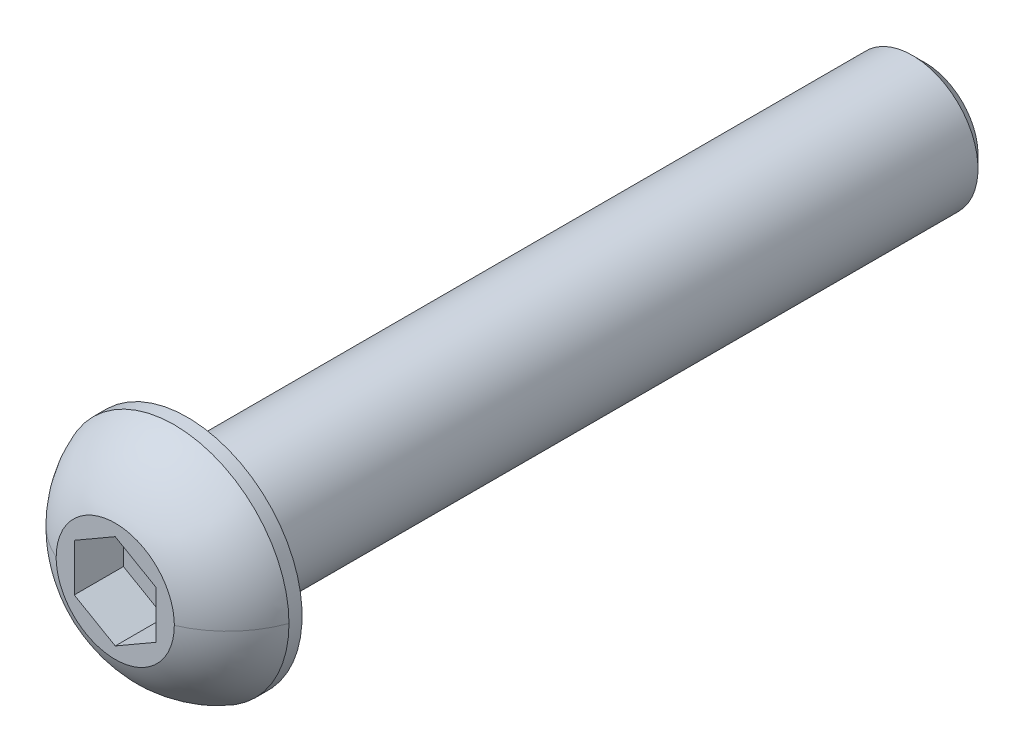
ISO-10303-21;
HEADER;
FILE_DESCRIPTION(('STEP AP214'),'2;1');
FILE_NAME('part.step','',(''),(''),'','','');
FILE_SCHEMA(('AUTOMOTIVE_DESIGN { 1 0 10303 214 1 1 1 1 }'));
ENDSEC;
DATA;
#1=APPLICATION_CONTEXT('core data for automotive mechanical design processes');
#2=APPLICATION_PROTOCOL_DEFINITION('international standard','automotive_design',2000,#1);
#3=PRODUCT_CONTEXT('',#1,'mechanical');
#4=PRODUCT('Part','Part','',(#3));
#5=PRODUCT_RELATED_PRODUCT_CATEGORY('part','',(#4));
#6=PRODUCT_DEFINITION_FORMATION('','',#4);
#7=PRODUCT_DEFINITION_CONTEXT('part definition',#1,'design');
#8=PRODUCT_DEFINITION('design','',#6,#7);
#9=PRODUCT_DEFINITION_SHAPE('','',#8);
#10=(LENGTH_UNIT() NAMED_UNIT(*) SI_UNIT(.MILLI.,.METRE.));
#11=(NAMED_UNIT(*) PLANE_ANGLE_UNIT() SI_UNIT($,.RADIAN.));
#12=(NAMED_UNIT(*) SI_UNIT($,.STERADIAN.) SOLID_ANGLE_UNIT());
#13=UNCERTAINTY_MEASURE_WITH_UNIT(LENGTH_MEASURE(1.E-05),#10,'distance_accuracy_value','');
#14=(GEOMETRIC_REPRESENTATION_CONTEXT(3) GLOBAL_UNCERTAINTY_ASSIGNED_CONTEXT((#13)) GLOBAL_UNIT_ASSIGNED_CONTEXT((#10,
#11,#12)) REPRESENTATION_CONTEXT('',''));
#15=CARTESIAN_POINT('',(0.,0.,0.));
#16=DIRECTION('',(0.,0.,1.));
#17=DIRECTION('',(1.,0.,0.));
#18=AXIS2_PLACEMENT_3D('',#15,#16,#17);
#19=CARTESIAN_POINT('',(0.,0.,1.4));
#20=DIRECTION('',(0.,0.,-1.));
#21=DIRECTION('',(0.,-1.,0.));
#22=AXIS2_PLACEMENT_3D('',#19,#20,#21);
#23=PLANE('',#22);
#24=DIRECTION('',(-0.866025403795548,0.499999999980758,0.));
#25=VECTOR('',#24,1.);
#26=CARTESIAN_POINT('',(1.25,2.16506350945,1.4));
#27=LINE('',#26,#25);
#28=CARTESIAN_POINT('',(2.5,1.443375673,1.4));
#29=VERTEX_POINT('',#28);
#30=CARTESIAN_POINT('',(0.,2.8867513459,1.4));
#31=VERTEX_POINT('',#30);
#32=EDGE_CURVE('E211',#29,#31,#27,.T.);
#33=ORIENTED_EDGE('',*,*,#32,.T.);
#34=DIRECTION('',(-0.866025403795548,-0.499999999980758,0.));
#35=VECTOR('',#34,1.);
#36=CARTESIAN_POINT('',(-1.25,2.16506350945,1.4));
#37=LINE('',#36,#35);
#38=CARTESIAN_POINT('',(-2.5,1.443375673,1.4));
#39=VERTEX_POINT('',#38);
#40=EDGE_CURVE('E194',#31,#39,#37,.T.);
#41=ORIENTED_EDGE('',*,*,#40,.T.);
#42=DIRECTION('',(0.,-1.,0.));
#43=VECTOR('',#42,1.);
#44=CARTESIAN_POINT('',(-2.5,0.,1.4));
#45=LINE('',#44,#43);
#46=CARTESIAN_POINT('',(-2.5,-1.443375673,1.4));
#47=VERTEX_POINT('',#46);
#48=EDGE_CURVE('E235',#39,#47,#45,.T.);
#49=ORIENTED_EDGE('',*,*,#48,.T.);
#50=DIRECTION('',(0.866025403795548,-0.499999999980758,0.));
#51=VECTOR('',#50,1.);
#52=CARTESIAN_POINT('',(-1.25,-2.16506350945,1.4));
#53=LINE('',#52,#51);
#54=CARTESIAN_POINT('',(0.,-2.8867513459,1.4));
#55=VERTEX_POINT('',#54);
#56=EDGE_CURVE('E208',#47,#55,#53,.T.);
#57=ORIENTED_EDGE('',*,*,#56,.T.);
#58=DIRECTION('',(0.866025403795548,0.499999999980758,0.));
#59=VECTOR('',#58,1.);
#60=CARTESIAN_POINT('',(1.25,-2.16506350945,1.4));
#61=LINE('',#60,#59);
#62=CARTESIAN_POINT('',(2.5,-1.443375673,1.4));
#63=VERTEX_POINT('',#62);
#64=EDGE_CURVE('E29',#55,#63,#61,.T.);
#65=ORIENTED_EDGE('',*,*,#64,.T.);
#66=DIRECTION('',(0.,1.,0.));
#67=VECTOR('',#66,1.);
#68=CARTESIAN_POINT('',(2.5,0.7216878365,1.4));
#69=LINE('',#68,#67);
#70=EDGE_CURVE('E11',#63,#29,#69,.T.);
#71=ORIENTED_EDGE('',*,*,#70,.T.);
#72=EDGE_LOOP('',(#33,#41,#49,#57,#65,#71));
#73=FACE_BOUND('',#72,.T.);
#74=ADVANCED_FACE('F16',(#73),#23,.F.);
#75=CARTESIAN_POINT('',(2.5,0.7216878365,4.4));
#76=DIRECTION('',(1.,0.,0.));
#77=DIRECTION('',(0.,1.,0.));
#78=AXIS2_PLACEMENT_3D('',#75,#76,#77);
#79=PLANE('',#78);
#80=DIRECTION('',(0.,0.,1.));
#81=VECTOR('',#80,1.);
#82=CARTESIAN_POINT('',(2.5,-1.443375673,4.4));
#83=LINE('',#82,#81);
#84=CARTESIAN_POINT('',(2.5,-1.443375673,4.39999999992791));
#85=VERTEX_POINT('',#84);
#86=EDGE_CURVE('E96',#63,#85,#83,.T.);
#87=ORIENTED_EDGE('',*,*,#86,.T.);
#88=DIRECTION('',(0.,-1.,0.));
#89=VECTOR('',#88,1.);
#90=CARTESIAN_POINT('',(2.5,0.,4.39999999971163));
#91=LINE('',#90,#89);
#92=CARTESIAN_POINT('',(2.5,1.443375673,4.39999999992791));
#93=VERTEX_POINT('',#92);
#94=EDGE_CURVE('E184',#93,#85,#91,.T.);
#95=ORIENTED_EDGE('',*,*,#94,.F.);
#96=DIRECTION('',(0.,0.,-1.));
#97=VECTOR('',#96,1.);
#98=CARTESIAN_POINT('',(2.5,1.443375673,4.4));
#99=LINE('',#98,#97);
#100=EDGE_CURVE('E220',#93,#29,#99,.T.);
#101=ORIENTED_EDGE('',*,*,#100,.T.);
#102=ORIENTED_EDGE('',*,*,#70,.F.);
#103=EDGE_LOOP('',(#87,#95,#101,#102));
#104=FACE_BOUND('',#103,.T.);
#105=ADVANCED_FACE('F18',(#104),#79,.F.);
#106=CARTESIAN_POINT('',(1.25,-2.16506350945,4.4));
#107=DIRECTION('',(0.499999999980758,-0.866025403795548,0.));
#108=DIRECTION('',(0.,0.,-1.));
#109=AXIS2_PLACEMENT_3D('',#106,#107,#108);
#110=PLANE('',#109);
#111=DIRECTION('',(0.,0.,1.));
#112=VECTOR('',#111,1.);
#113=CARTESIAN_POINT('',(0.,-2.8867513459,4.4));
#114=LINE('',#113,#112);
#115=CARTESIAN_POINT('',(0.,-2.8867513459,4.39999999996154));
#116=VERTEX_POINT('',#115);
#117=EDGE_CURVE('E107',#55,#116,#114,.T.);
#118=ORIENTED_EDGE('',*,*,#117,.T.);
#119=DIRECTION('',(-0.866025403795548,-0.499999999980758,4.65924845029122E-11));
#120=VECTOR('',#119,1.);
#121=CARTESIAN_POINT('',(2.5,-1.443375673,4.39999999971163));
#122=LINE('',#121,#120);
#123=EDGE_CURVE('E187',#85,#116,#122,.T.);
#124=ORIENTED_EDGE('',*,*,#123,.F.);
#125=ORIENTED_EDGE('',*,*,#86,.F.);
#126=ORIENTED_EDGE('',*,*,#64,.F.);
#127=EDGE_LOOP('',(#118,#124,#125,#126));
#128=FACE_BOUND('',#127,.T.);
#129=ADVANCED_FACE('F277',(#128),#110,.F.);
#130=CARTESIAN_POINT('',(-1.25,-2.16506350945,4.4));
#131=DIRECTION('',(-0.499999999980758,-0.866025403795548,0.));
#132=DIRECTION('',(-0.866025403795548,0.499999999980758,0.));
#133=AXIS2_PLACEMENT_3D('',#130,#131,#132);
#134=PLANE('',#133);
#135=DIRECTION('',(0.,0.,1.));
#136=VECTOR('',#135,1.);
#137=CARTESIAN_POINT('',(-2.5,-1.443375673,4.4));
#138=LINE('',#137,#136);
#139=CARTESIAN_POINT('',(-2.5,-1.443375673,4.39999999999516));
#140=VERTEX_POINT('',#139);
#141=EDGE_CURVE('E198',#47,#140,#138,.T.);
#142=ORIENTED_EDGE('',*,*,#141,.T.);
#143=DIRECTION('',(-0.866025403795548,0.499999999980758,4.65924845029122E-11));
#144=VECTOR('',#143,1.);
#145=CARTESIAN_POINT('',(0.,-2.8867513459,4.39999999984614));
#146=LINE('',#145,#144);
#147=EDGE_CURVE('E221',#116,#140,#146,.T.);
#148=ORIENTED_EDGE('',*,*,#147,.F.);
#149=ORIENTED_EDGE('',*,*,#117,.F.);
#150=ORIENTED_EDGE('',*,*,#56,.F.);
#151=EDGE_LOOP('',(#142,#148,#149,#150));
#152=FACE_BOUND('',#151,.T.);
#153=ADVANCED_FACE('F280',(#152),#134,.F.);
#154=CARTESIAN_POINT('',(-2.5,0.,4.4));
#155=DIRECTION('',(-1.,0.,0.));
#156=DIRECTION('',(0.,0.,1.));
#157=AXIS2_PLACEMENT_3D('',#154,#155,#156);
#158=PLANE('',#157);
#159=DIRECTION('',(0.,0.,1.));
#160=VECTOR('',#159,1.);
#161=CARTESIAN_POINT('',(-2.5,1.443375673,4.4));
#162=LINE('',#161,#160);
#163=CARTESIAN_POINT('',(-2.5,1.443375673,4.39999999999516));
#164=VERTEX_POINT('',#163);
#165=EDGE_CURVE('E199',#39,#164,#162,.T.);
#166=ORIENTED_EDGE('',*,*,#165,.T.);
#167=DIRECTION('',(0.,1.,0.));
#168=VECTOR('',#167,1.);
#169=CARTESIAN_POINT('',(-2.5,0.,4.39999999998064));
#170=LINE('',#169,#168);
#171=EDGE_CURVE('E216',#140,#164,#170,.T.);
#172=ORIENTED_EDGE('',*,*,#171,.F.);
#173=ORIENTED_EDGE('',*,*,#141,.F.);
#174=ORIENTED_EDGE('',*,*,#48,.F.);
#175=EDGE_LOOP('',(#166,#172,#173,#174));
#176=FACE_BOUND('',#175,.T.);
#177=ADVANCED_FACE('F352',(#176),#158,.F.);
#178=CARTESIAN_POINT('',(-1.25,2.16506350945,4.4));
#179=DIRECTION('',(-0.499999999980758,0.866025403795548,0.));
#180=DIRECTION('',(0.,0.,1.));
#181=AXIS2_PLACEMENT_3D('',#178,#179,#180);
#182=PLANE('',#181);
#183=DIRECTION('',(0.,0.,1.));
#184=VECTOR('',#183,1.);
#185=CARTESIAN_POINT('',(0.,2.8867513459,4.4));
#186=LINE('',#185,#184);
#187=CARTESIAN_POINT('',(0.,2.8867513459,4.39999999996154));
#188=VERTEX_POINT('',#187);
#189=EDGE_CURVE('E226',#31,#188,#186,.T.);
#190=ORIENTED_EDGE('',*,*,#189,.T.);
#191=DIRECTION('',(0.866025403795548,0.499999999980758,-4.65924845029122E-11));
#192=VECTOR('',#191,1.);
#193=CARTESIAN_POINT('',(-2.5,1.443375673,4.39999999998064));
#194=LINE('',#193,#192);
#195=EDGE_CURVE('E212',#164,#188,#194,.T.);
#196=ORIENTED_EDGE('',*,*,#195,.F.);
#197=ORIENTED_EDGE('',*,*,#165,.F.);
#198=ORIENTED_EDGE('',*,*,#40,.F.);
#199=EDGE_LOOP('',(#190,#196,#197,#198));
#200=FACE_BOUND('',#199,.T.);
#201=ADVANCED_FACE('F272',(#200),#182,.F.);
#202=CARTESIAN_POINT('',(1.25,2.16506350945,4.4));
#203=DIRECTION('',(0.499999999980758,0.866025403795548,0.));
#204=DIRECTION('',(0.,0.,-1.));
#205=AXIS2_PLACEMENT_3D('',#202,#203,#204);
#206=PLANE('',#205);
#207=ORIENTED_EDGE('',*,*,#100,.F.);
#208=DIRECTION('',(0.866025403795548,-0.499999999980758,-4.65924845029122E-11));
#209=VECTOR('',#208,1.);
#210=CARTESIAN_POINT('',(0.,2.8867513459,4.39999999984614));
#211=LINE('',#210,#209);
#212=EDGE_CURVE('E188',#188,#93,#211,.T.);
#213=ORIENTED_EDGE('',*,*,#212,.F.);
#214=ORIENTED_EDGE('',*,*,#189,.F.);
#215=ORIENTED_EDGE('',*,*,#32,.F.);
#216=EDGE_LOOP('',(#207,#213,#214,#215));
#217=FACE_BOUND('',#216,.T.);
#218=ADVANCED_FACE('F264',(#217),#206,.F.);
#219=CARTESIAN_POINT('',(-3.23151399999418,0.,4.40000000001999));
#220=DIRECTION('',(5.38003067374176E-11,0.,1.));
#221=DIRECTION('',(1.,0.,-5.38003067374176E-11));
#222=AXIS2_PLACEMENT_3D('',#219,#220,#221);
#223=PLANE('',#222);
#224=ORIENTED_EDGE('',*,*,#195,.T.);
#225=ORIENTED_EDGE('',*,*,#212,.T.);
#226=ORIENTED_EDGE('',*,*,#94,.T.);
#227=ORIENTED_EDGE('',*,*,#123,.T.);
#228=ORIENTED_EDGE('',*,*,#147,.T.);
#229=ORIENTED_EDGE('',*,*,#171,.T.);
#230=EDGE_LOOP('',(#224,#225,#226,#227,#228,#229));
#231=FACE_BOUND('',#230,.T.);
#232=CARTESIAN_POINT('',(3.60302799998836,0.,4.40000000003998));
#233=CARTESIAN_POINT('',(3.60302799998835,-7.20605599997671,4.40000000003997));
#234=CARTESIAN_POINT('',(-3.60302799998835,-7.20605599997671,4.40000000003997));
#235=CARTESIAN_POINT('',(-3.60302799998836,0.,4.40000000003998));
#236=(BOUNDED_CURVE() B_SPLINE_CURVE(3,(#232,#233,#234,#235),.UNSPECIFIED.,.F.,
.F.) B_SPLINE_CURVE_WITH_KNOTS((4,4),(0.,1.),
.UNSPECIFIED.) CURVE() GEOMETRIC_REPRESENTATION_ITEM() RATIONAL_B_SPLINE_CURVE((1.,
0.333333333333334,0.333333333333334,1.)) REPRESENTATION_ITEM(''));
#237=CARTESIAN_POINT('',(3.60302800088751,0.,4.39999999965229));
#238=VERTEX_POINT('',#237);
#239=CARTESIAN_POINT('',(-3.60302799998836,0.,4.40000000003998));
#240=VERTEX_POINT('',#239);
#241=EDGE_CURVE('E153',#238,#240,#236,.T.);
#242=ORIENTED_EDGE('',*,*,#241,.F.);
#243=CARTESIAN_POINT('',(-3.60302799998836,0.,4.40000000003998));
#244=CARTESIAN_POINT('',(-3.60302799998835,7.20605599997671,4.40000000003997));
#245=CARTESIAN_POINT('',(3.60302799998835,7.20605599997671,4.40000000003997));
#246=CARTESIAN_POINT('',(3.60302799998836,0.,4.40000000003998));
#247=(BOUNDED_CURVE() B_SPLINE_CURVE(3,(#243,#244,#245,#246),.UNSPECIFIED.,.F.,
.F.) B_SPLINE_CURVE_WITH_KNOTS((4,4),(0.,1.),
.UNSPECIFIED.) CURVE() GEOMETRIC_REPRESENTATION_ITEM() RATIONAL_B_SPLINE_CURVE((1.,
0.333333333333334,0.333333333333334,1.)) REPRESENTATION_ITEM(''));
#248=EDGE_CURVE('E318',#240,#238,#247,.T.);
#249=ORIENTED_EDGE('',*,*,#248,.F.);
#250=EDGE_LOOP('',(#242,#249));
#251=FACE_BOUND('',#250,.T.);
#252=ADVANCED_FACE('F263',(#231,#251),#223,.T.);
#253=CARTESIAN_POINT('',(7.00000000001201,0.,0.800000000004371));
#254=CARTESIAN_POINT('',(7.00000000001202,-14.000000000024,0.80000000000437));
#255=CARTESIAN_POINT('',(-7.000000000012,-14.000000000024,0.80000000000437));
#256=CARTESIAN_POINT('',(-7.00000000001201,0.,0.800000000004371));
#257=CARTESIAN_POINT('',(6.40314763385102,0.,2.43983839879311));
#258=CARTESIAN_POINT('',(6.40314763385103,-12.8062952677021,2.43983839879312));
#259=CARTESIAN_POINT('',(-6.40314763385102,-12.8062952677021,2.43983839879312));
#260=CARTESIAN_POINT('',(-6.40314763385102,0.,2.43983839879311));
#261=CARTESIAN_POINT('',(5.20549930768776,0.,3.70906698654725));
#262=CARTESIAN_POINT('',(5.20549930768777,-10.4109986153755,3.70906698654725));
#263=CARTESIAN_POINT('',(-5.20549930768777,-10.4109986153755,3.70906698654725));
#264=CARTESIAN_POINT('',(-5.20549930768776,0.,3.70906698654725));
#265=CARTESIAN_POINT('',(3.60302799998836,0.,4.40000000003998));
#266=CARTESIAN_POINT('',(3.60302799998835,-7.20605599997671,4.40000000003997));
#267=CARTESIAN_POINT('',(-3.60302799998835,-7.20605599997671,4.40000000003997));
#268=CARTESIAN_POINT('',(-3.60302799998836,0.,4.40000000003998));
#269=(BOUNDED_SURFACE() B_SPLINE_SURFACE(3,3,((#253,#254,#255,#256),(#257,#258,#259,#260),(#261,
#262,#263,#264),(#265,#266,#267,#268)),.UNSPECIFIED.,.F.,.F.,
.F.) B_SPLINE_SURFACE_WITH_KNOTS((4,4),(4,4),(0.,1.),(0.,1.),
.UNSPECIFIED.) GEOMETRIC_REPRESENTATION_ITEM() RATIONAL_B_SPLINE_SURFACE(((1.,0.333333333333334,
0.333333333333334,1.),(0.945456170456447,0.315152056818816,0.315152056818816,0.945456170456447),
(0.945456170456447,0.315152056818816,0.315152056818816,0.945456170456447),(1.,0.333333333333334,
0.333333333333334,1.))) REPRESENTATION_ITEM('') SURFACE());
#270=CARTESIAN_POINT('',(-1.129567382,0.,-1.3366627352));
#271=DIRECTION('',(0.,1.,0.));
#272=DIRECTION('',(-1.,0.,0.));
#273=AXIS2_PLACEMENT_3D('',#270,#271,#272);
#274=CIRCLE('',#273,6.2471839069);
#275=CARTESIAN_POINT('',(-7.,0.,0.8));
#276=VERTEX_POINT('',#275);
#277=EDGE_CURVE('E205',#276,#240,#274,.T.);
#278=CARTESIAN_POINT('',(0.,0.,0.8));
#279=DIRECTION('',(0.,0.,-1.));
#280=DIRECTION('',(-1.,0.,0.));
#281=AXIS2_PLACEMENT_3D('',#278,#279,#280);
#282=CIRCLE('',#281,7.);
#283=CARTESIAN_POINT('',(7.,0.,0.8));
#284=VERTEX_POINT('',#283);
#285=EDGE_CURVE('E224',#284,#276,#282,.T.);
#286=CARTESIAN_POINT('',(1.129567382,0.,-1.3366627352));
#287=DIRECTION('',(0.,-1.,0.));
#288=DIRECTION('',(1.,0.,0.));
#289=AXIS2_PLACEMENT_3D('',#286,#287,#288);
#290=CIRCLE('',#289,6.2471839069);
#291=EDGE_CURVE('E322',#284,#238,#290,.T.);
#292=ORIENTED_EDGE('',*,*,#277,.F.);
#293=ORIENTED_EDGE('',*,*,#285,.F.);
#294=ORIENTED_EDGE('',*,*,#291,.T.);
#295=ORIENTED_EDGE('',*,*,#241,.T.);
#296=EDGE_LOOP('',(#292,#293,#294,#295));
#297=FACE_BOUND('',#296,.T.);
#298=ADVANCED_FACE('F252',(#297),#269,.T.);
#299=CARTESIAN_POINT('',(-5.7,0.,0.));
#300=DIRECTION('',(0.,0.,-1.));
#301=DIRECTION('',(0.,-1.,0.));
#302=AXIS2_PLACEMENT_3D('',#299,#300,#301);
#303=PLANE('',#302);
#304=CARTESIAN_POINT('',(4.4,0.,0.));
#305=CARTESIAN_POINT('',(4.4,0.279668025432633,0.));
#306=CARTESIAN_POINT('',(4.36138356558434,0.691871134766137,0.));
#307=CARTESIAN_POINT('',(4.24875229853866,1.16000163689486,0.));
#308=CARTESIAN_POINT('',(4.17554197495896,1.39087360660247,0.));
#309=CARTESIAN_POINT('',(4.14054583126976,1.48913446190071,0.));
#310=CARTESIAN_POINT('',(4.11641055975997,1.55448963774922,0.));
#311=CARTESIAN_POINT('',(4.10473132809077,1.58509334722968,0.));
#312=CARTESIAN_POINT('',(4.03641731101037,1.75771022144249,0.));
#313=CARTESIAN_POINT('',(3.94439286634805,1.95979362007298,0.));
#314=CARTESIAN_POINT('',(3.83729698543698,2.15429174306613,0.));
#315=CARTESIAN_POINT('',(3.76255052344098,2.2822715415866,0.));
#316=CARTESIAN_POINT('',(3.72427835470282,2.34423188300952,0.));
#317=CARTESIAN_POINT('',(3.51678782799904,2.66168704243505,0.));
#318=CARTESIAN_POINT('',(3.32577945951767,2.89670770457325,0.));
#319=CARTESIAN_POINT('',(3.00401502607238,3.21855090354459,0.));
#320=CARTESIAN_POINT('',(2.83563055242028,3.37045050480508,0.));
#321=CARTESIAN_POINT('',(2.65599269337402,3.50881710872781,0.));
#322=CARTESIAN_POINT('',(2.53373336836668,3.59805417860123,0.));
#323=CARTESIAN_POINT('',(2.46987102109263,3.64213840503934,0.));
#324=CARTESIAN_POINT('',(2.28342670249863,3.76406393800753,0.));
#325=CARTESIAN_POINT('',(2.09169126909883,3.87606273890571,0.));
#326=CARTESIAN_POINT('',(1.85874047922226,3.98935622549772,0.));
#327=CARTESIAN_POINT('',(1.73995022155643,4.04166002351308,0.));
#328=CARTESIAN_POINT('',(1.68854406911517,4.06314530581668,0.));
#329=CARTESIAN_POINT('',(1.65416306926255,4.07726202043428,0.));
#330=CARTESIAN_POINT('',(1.63586301223017,4.08463456112947,0.));
#331=CARTESIAN_POINT('',(1.09973543701847,4.2969553581217,0.));
#332=CARTESIAN_POINT('',(0.559165745137802,4.39993260063115,0.));
#333=CARTESIAN_POINT('',(-0.279582872568903,4.40003369968443,0.));
#334=CARTESIAN_POINT('',(-0.69172211725461,4.36144254003208,0.));
#335=CARTESIAN_POINT('',(-1.15988987376122,4.24879652937446,0.));
#336=CARTESIAN_POINT('',(-1.39080841144118,4.17556777627984,0.));
#337=CARTESIAN_POINT('',(-1.48909521175259,4.14056136471806,0.));
#338=CARTESIAN_POINT('',(-1.55446901479004,4.11641872140229,0.));
#339=CARTESIAN_POINT('',(-1.58509334722956,4.10473132809082,0.));
#340=CARTESIAN_POINT('',(-1.75771022144296,4.03641731101018,0.));
#341=CARTESIAN_POINT('',(-1.9597936200738,3.94439286634773,0.));
#342=CARTESIAN_POINT('',(-2.15429174306678,3.83729698543672,0.));
#343=CARTESIAN_POINT('',(-2.28227154158701,3.76255052344081,0.));
#344=CARTESIAN_POINT('',(-2.34423188300926,3.72427835470306,0.));
#345=CARTESIAN_POINT('',(-2.66168704243612,3.51678782799809,0.));
#346=CARTESIAN_POINT('',(-2.89670770457279,3.32577945951826,0.));
#347=CARTESIAN_POINT('',(-3.21855090354482,3.00401502607209,0.));
#348=CARTESIAN_POINT('',(-3.37045050480548,2.83563055241977,0.));
#349=CARTESIAN_POINT('',(-3.50881710872813,2.65599269337361,0.));
#350=CARTESIAN_POINT('',(-3.59805417860144,2.53373336836643,0.));
#351=CARTESIAN_POINT('',(-3.64213840503927,2.46987102109275,0.));
#352=CARTESIAN_POINT('',(-3.76406393800765,2.28342670249838,0.));
#353=CARTESIAN_POINT('',(-3.87606273890593,2.09169126909839,0.));
#354=CARTESIAN_POINT('',(-3.98935622549787,1.85874047922192,0.));
#355=CARTESIAN_POINT('',(-4.04166002351317,1.73995022155624,0.));
#356=CARTESIAN_POINT('',(-4.06314530581674,1.68854406911506,0.));
#357=CARTESIAN_POINT('',(-4.07726202043431,1.65416306926248,0.));
#358=CARTESIAN_POINT('',(-4.08463245227209,1.63586833726954,0.));
#359=CARTESIAN_POINT('',(-4.29702284155824,1.09956503575887,0.));
#360=CARTESIAN_POINT('',(-4.4,0.559692795068131,0.));
#361=CARTESIAN_POINT('',(-4.4,0.,0.));
#362=(BOUNDED_CURVE() B_SPLINE_CURVE(3,(#304,#305,#306,#307,#308,#309,#310,#311,#312,#313,#314,
#315,#316,#317,#318,#319,#320,#321,#322,#323,#324,#325,#326,#327,#328,#329,#330,#331,#332,#333,
#334,#335,#336,#337,#338,#339,#340,#341,#342,#343,#344,#345,#346,#347,#348,#349,#350,#351,#352,
#353,#354,#355,#356,#357,#358,#359,#360,#361),.UNSPECIFIED.,.F.,
.F.) B_SPLINE_CURVE_WITH_KNOTS((4,1,1,1,2,2,1,2,2,2,1,2,2,1,1,1,2,2,2,1,1,1,2,2,1,2,2,2,1,2,2,1,
1,1,2,2,4),(0.,0.0625000000000017,0.0937500000000026,0.109375000000003,0.117187500000003,
0.125000000000003,0.156250000000004,0.171875000000004,0.187500000000004,0.250000000000005,
0.281250000000005,0.296875000000005,0.312500000000005,0.343750000000005,0.359375000000006,
0.367187500000006,0.371093750000006,0.375000000000005,0.5,0.5625,0.59375,0.609375,0.6171875,
0.625,0.65625,0.671875,0.6875,0.75,0.78125,0.796875,0.8125,0.84375,0.859375,0.8671875,
0.871093750000001,0.875,1.),
.UNSPECIFIED.) CURVE() GEOMETRIC_REPRESENTATION_ITEM() RATIONAL_B_SPLINE_CURVE((1.,1.,1.,1.,1.,
1.,1.,1.,1.,1.,1.,1.,1.,1.,1.,1.,1.,1.,1.,1.,1.,1.,1.,1.,1.,1.,1.,1.,1.,1.,1.,1.,1.,1.,1.,1.,1.,
1.,1.,1.,1.,1.,1.,1.,1.,1.,1.,1.,1.,1.,1.,1.,1.,1.,1.,1.,1.,1.)) REPRESENTATION_ITEM(''));
#363=CARTESIAN_POINT('',(4.4,0.,0.));
#364=VERTEX_POINT('',#363);
#365=CARTESIAN_POINT('',(-4.4,0.,0.));
#366=VERTEX_POINT('',#365);
#367=EDGE_CURVE('E142',#364,#366,#362,.T.);
#368=ORIENTED_EDGE('',*,*,#367,.T.);
#369=CARTESIAN_POINT('',(-4.4,0.,0.));
#370=CARTESIAN_POINT('',(-4.4,-0.279668025433285,0.));
#371=CARTESIAN_POINT('',(-4.36138356558433,-0.691871134767278,0.));
#372=CARTESIAN_POINT('',(-4.24875229853865,-1.16000163689572,0.));
#373=CARTESIAN_POINT('',(-4.17554197495896,-1.39087360660297,0.));
#374=CARTESIAN_POINT('',(-4.14054583126976,-1.48913446190101,0.));
#375=CARTESIAN_POINT('',(-4.11641055975997,-1.55448963774938,0.));
#376=CARTESIAN_POINT('',(-4.1047313280909,-1.58509334722943,0.));
#377=CARTESIAN_POINT('',(-4.03641731100983,-1.75771022144349,0.));
#378=CARTESIAN_POINT('',(-3.94439286634711,-1.95979362007473,0.));
#379=CARTESIAN_POINT('',(-3.83729698543624,-2.15429174306751,0.));
#380=CARTESIAN_POINT('',(-3.76255052344051,-2.28227154158747,0.));
#381=CARTESIAN_POINT('',(-3.72427835470306,-2.34423188300926,0.));
#382=CARTESIAN_POINT('',(-3.51678782799809,-2.66168704243612,0.));
#383=CARTESIAN_POINT('',(-3.3257794595192,-2.89670770457184,0.));
#384=CARTESIAN_POINT('',(-3.00401502607161,-3.2185509035453,0.));
#385=CARTESIAN_POINT('',(-2.83563055241894,-3.37045050480631,0.));
#386=CARTESIAN_POINT('',(-2.65599269337296,-3.50881710872877,0.));
#387=CARTESIAN_POINT('',(-2.53373336836601,-3.59805417860185,0.));
#388=CARTESIAN_POINT('',(-2.46987102109335,-3.64213840503896,0.));
#389=CARTESIAN_POINT('',(-2.28342670249718,-3.76406393800828,0.));
#390=CARTESIAN_POINT('',(-2.09169126909629,-3.87606273890702,0.));
#391=CARTESIAN_POINT('',(-1.85874047922035,-3.9893562254987,0.));
#392=CARTESIAN_POINT('',(-1.73995022155532,-4.04166002351365,0.));
#393=CARTESIAN_POINT('',(-1.68854406911451,-4.06314530581702,0.));
#394=CARTESIAN_POINT('',(-1.6541630692622,-4.07726202043446,0.));
#395=CARTESIAN_POINT('',(-1.63586301223022,-4.08463456112947,0.));
#396=CARTESIAN_POINT('',(-1.09973543701682,-4.2969553581217,0.));
#397=CARTESIAN_POINT('',(-0.559165745138986,-4.39993260063115,0.));
#398=CARTESIAN_POINT('',(0.279582872569496,-4.40003369968443,0.));
#399=CARTESIAN_POINT('',(0.691722117255647,-4.36144254003208,0.));
#400=CARTESIAN_POINT('',(1.159889873762,-4.24879652937446,0.));
#401=CARTESIAN_POINT('',(1.39080841144163,-4.17556777627984,0.));
#402=CARTESIAN_POINT('',(1.48909521175286,-4.14056136471805,0.));
#403=CARTESIAN_POINT('',(1.55446901479018,-4.11641872140229,0.));
#404=CARTESIAN_POINT('',(1.58509334722936,-4.10473132809092,0.));
#405=CARTESIAN_POINT('',(1.75771022144375,-4.03641731100975,0.));
#406=CARTESIAN_POINT('',(1.95979362007519,-3.94439286634696,0.));
#407=CARTESIAN_POINT('',(2.15429174306787,-3.83729698543612,0.));
#408=CARTESIAN_POINT('',(2.2822715415877,-3.76255052344044,0.));
#409=CARTESIAN_POINT('',(2.34423188300878,-3.72427835470341,0.));
#410=CARTESIAN_POINT('',(2.661687042438,-3.5167878279967,0.));
#411=CARTESIAN_POINT('',(2.89670770457056,-3.32577945952098,0.));
#412=CARTESIAN_POINT('',(3.21855090354593,-3.00401502607073,0.));
#413=CARTESIAN_POINT('',(3.37045050480743,-2.8356305524174,0.));
#414=CARTESIAN_POINT('',(3.50881710872966,-2.65599269337174,0.));
#415=CARTESIAN_POINT('',(3.5980541786024,-2.53373336836524,0.));
#416=CARTESIAN_POINT('',(3.64213840503895,-2.46987102109342,0.));
#417=CARTESIAN_POINT('',(3.76406393800831,-2.28342670249704,0.));
#418=CARTESIAN_POINT('',(3.87606273890708,-2.09169126909604,0.));
#419=CARTESIAN_POINT('',(3.98935622549874,-1.85874047922017,0.));
#420=CARTESIAN_POINT('',(4.04166002351368,-1.73995022155521,0.));
#421=CARTESIAN_POINT('',(4.06314530581704,-1.68854406911444,0.));
#422=CARTESIAN_POINT('',(4.07726202043447,-1.65416306926216,0.));
#423=CARTESIAN_POINT('',(4.08463245227209,-1.63586833726957,0.));
#424=CARTESIAN_POINT('',(4.29702284155823,-1.09956503575768,0.));
#425=CARTESIAN_POINT('',(4.4,-0.559692795066934,0.));
#426=CARTESIAN_POINT('',(4.4,0.,0.));
#427=(BOUNDED_CURVE() B_SPLINE_CURVE(3,(#369,#370,#371,#372,#373,#374,#375,#376,#377,#378,#379,
#380,#381,#382,#383,#384,#385,#386,#387,#388,#389,#390,#391,#392,#393,#394,#395,#396,#397,#398,
#399,#400,#401,#402,#403,#404,#405,#406,#407,#408,#409,#410,#411,#412,#413,#414,#415,#416,#417,
#418,#419,#420,#421,#422,#423,#424,#425,#426),.UNSPECIFIED.,.F.,
.F.) B_SPLINE_CURVE_WITH_KNOTS((4,1,1,1,2,2,1,2,2,2,1,2,2,1,1,1,2,2,2,1,1,1,2,2,1,2,2,2,1,2,2,1,
1,1,2,2,4),(0.,0.0625,0.09375,0.109375,0.1171875,0.125,0.15625,0.171875,0.1875,0.25,0.28125,
0.296875,0.3125,0.34375,0.359375,0.3671875,0.371093749999998,0.375,0.5,0.5625,0.59375,0.609375,
0.6171875,0.625,0.65625,0.671875,0.6875,0.75,0.78125,0.796875,0.8125,0.84375,0.859375,0.8671875,
0.87109375,0.875,1.),
.UNSPECIFIED.) CURVE() GEOMETRIC_REPRESENTATION_ITEM() RATIONAL_B_SPLINE_CURVE((1.,1.,1.,1.,1.,
1.,1.,1.,1.,1.,1.,1.,1.,1.,1.,1.,1.,1.,1.,1.,1.,1.,1.,1.,1.,1.,1.,1.,1.,1.,1.,1.,1.,1.,1.,1.,1.,
1.,1.,1.,1.,1.,1.,1.,1.,1.,1.,1.,1.,1.,1.,1.,1.,1.,1.,1.,1.,1.)) REPRESENTATION_ITEM(''));
#428=EDGE_CURVE('E158',#366,#364,#427,.T.);
#429=ORIENTED_EDGE('',*,*,#428,.T.);
#430=EDGE_LOOP('',(#368,#429));
#431=FACE_BOUND('',#430,.T.);
#432=CARTESIAN_POINT('',(0.,0.,0.));
#433=DIRECTION('',(0.,0.,-1.));
#434=DIRECTION('',(-1.,0.,0.));
#435=AXIS2_PLACEMENT_3D('',#432,#433,#434);
#436=CIRCLE('',#435,7.);
#437=CARTESIAN_POINT('',(-7.,0.,0.));
#438=VERTEX_POINT('',#437);
#439=EDGE_CURVE('E154',#438,#438,#436,.T.);
#440=ORIENTED_EDGE('',*,*,#439,.T.);
#441=EDGE_LOOP('',(#440));
#442=FACE_BOUND('',#441,.T.);
#443=ADVANCED_FACE('F164',(#431,#442),#303,.T.);
#444=CARTESIAN_POINT('',(-1.6166,0.,-45.));
#445=DIRECTION('',(0.,0.,-1.));
#446=DIRECTION('',(0.,-1.,0.));
#447=AXIS2_PLACEMENT_3D('',#444,#445,#446);
#448=PLANE('',#447);
#449=CARTESIAN_POINT('',(0.,0.,-44.9999999999591));
#450=DIRECTION('',(0.,0.,1.));
#451=DIRECTION('',(1.,0.,0.));
#452=AXIS2_PLACEMENT_3D('',#449,#450,#451);
#453=CIRCLE('',#452,3.23319999995419);
#454=CARTESIAN_POINT('',(-3.23319999995419,0.,-44.9999999999591));
#455=VERTEX_POINT('',#454);
#456=EDGE_CURVE('E193',#455,#455,#453,.T.);
#457=ORIENTED_EDGE('',*,*,#456,.F.);
#458=EDGE_LOOP('',(#457));
#459=FACE_BOUND('',#458,.T.);
#460=ADVANCED_FACE('F276',(#459),#448,.T.);
#461=CARTESIAN_POINT('',(-4.4,0.,0.));
#462=CARTESIAN_POINT('',(-4.4,8.8,0.));
#463=CARTESIAN_POINT('',(4.4,8.8,0.));
#464=CARTESIAN_POINT('',(4.4,0.,0.));
#465=CARTESIAN_POINT('',(-4.16568542494924,0.,0.));
#466=CARTESIAN_POINT('',(-4.16568542494924,8.33137084989847,0.));
#467=CARTESIAN_POINT('',(4.16568542494924,8.33137084989847,0.));
#468=CARTESIAN_POINT('',(4.16568542494924,0.,0.));
#469=CARTESIAN_POINT('',(-4.,0.,-0.165685424949236));
#470=CARTESIAN_POINT('',(-4.,7.99999999999999,-0.165685424949236));
#471=CARTESIAN_POINT('',(3.99999999999999,7.99999999999999,-0.165685424949236));
#472=CARTESIAN_POINT('',(4.,0.,-0.165685424949236));
#473=CARTESIAN_POINT('',(-4.,0.,-0.4));
#474=CARTESIAN_POINT('',(-4.,7.99999999999999,-0.399999999999998));
#475=CARTESIAN_POINT('',(3.99999999999999,7.99999999999999,-0.399999999999998));
#476=CARTESIAN_POINT('',(4.,0.,-0.4));
#477=(BOUNDED_SURFACE() B_SPLINE_SURFACE(3,3,((#461,#462,#463,#464),(#465,#466,#467,#468),(#469,
#470,#471,#472),(#473,#474,#475,#476)),.UNSPECIFIED.,.F.,.F.,
.F.) B_SPLINE_SURFACE_WITH_KNOTS((4,4),(4,4),(0.,1.),(0.,1.),
.UNSPECIFIED.) GEOMETRIC_REPRESENTATION_ITEM() RATIONAL_B_SPLINE_SURFACE(((1.,0.333333333333334,
0.333333333333334,1.),(0.804737854124366,0.268245951374789,0.268245951374789,0.804737854124366),
(0.804737854124366,0.268245951374789,0.268245951374789,0.804737854124366),(1.,0.333333333333334,
0.333333333333334,1.))) REPRESENTATION_ITEM('') SURFACE());
#478=CARTESIAN_POINT('',(-4.4,0.,-0.4));
#479=DIRECTION('',(0.,1.,0.));
#480=DIRECTION('',(-1.,0.,0.));
#481=AXIS2_PLACEMENT_3D('',#478,#479,#480);
#482=CIRCLE('',#481,0.4);
#483=CARTESIAN_POINT('',(-4.,0.,-0.4));
#484=VERTEX_POINT('',#483);
#485=EDGE_CURVE('E148',#366,#484,#482,.T.);
#486=CARTESIAN_POINT('',(4.4,0.,-0.4));
#487=DIRECTION('',(0.,-1.,0.));
#488=DIRECTION('',(1.,0.,0.));
#489=AXIS2_PLACEMENT_3D('',#486,#487,#488);
#490=CIRCLE('',#489,0.4);
#491=CARTESIAN_POINT('',(4.,0.,-0.4));
#492=VERTEX_POINT('',#491);
#493=EDGE_CURVE('E145',#364,#492,#490,.T.);
#494=CARTESIAN_POINT('',(0.,0.,-0.4));
#495=DIRECTION('',(0.,0.,-1.));
#496=DIRECTION('',(-1.,0.,0.));
#497=AXIS2_PLACEMENT_3D('',#494,#495,#496);
#498=CIRCLE('',#497,4.);
#499=EDGE_CURVE('E178',#484,#492,#498,.T.);
#500=CARTESIAN_POINT('',(-4.40090509667992,0.,0.));
#501=CARTESIAN_POINT('',(-4.40090509667992,8.80181019335984,0.));
#502=CARTESIAN_POINT('',(4.40090509667991,8.80181019335984,0.));
#503=CARTESIAN_POINT('',(4.40090509667992,0.,0.));
#504=CARTESIAN_POINT('',(-4.40060339778661,0.,0.));
#505=CARTESIAN_POINT('',(-4.40060339778661,8.80120679557322,0.));
#506=CARTESIAN_POINT('',(4.40060339778661,8.80120679557322,0.));
#507=CARTESIAN_POINT('',(4.40060339778661,0.,0.));
#508=CARTESIAN_POINT('',(-4.40030169889331,0.,0.));
#509=CARTESIAN_POINT('',(-4.40030169889331,8.80060339778661,0.));
#510=CARTESIAN_POINT('',(4.4003016988933,8.80060339778661,0.));
#511=CARTESIAN_POINT('',(4.40030169889331,0.,0.));
#512=CARTESIAN_POINT('',(-4.4,0.,0.));
#513=CARTESIAN_POINT('',(-4.4,8.8,0.));
#514=CARTESIAN_POINT('',(4.4,8.8,0.));
#515=CARTESIAN_POINT('',(4.4,0.,0.));
#516=CARTESIAN_POINT('',(-4.16568542494924,0.,0.));
#517=CARTESIAN_POINT('',(-4.16568542494924,8.33137084989847,0.));
#518=CARTESIAN_POINT('',(4.16568542494924,8.33137084989847,0.));
#519=CARTESIAN_POINT('',(4.16568542494924,0.,0.));
#520=CARTESIAN_POINT('',(-4.,0.,-0.165685424949236));
#521=CARTESIAN_POINT('',(-4.,7.99999999999999,-0.165685424949236));
#522=CARTESIAN_POINT('',(3.99999999999999,7.99999999999999,-0.165685424949236));
#523=CARTESIAN_POINT('',(4.,0.,-0.165685424949236));
#524=CARTESIAN_POINT('',(-4.,0.,-0.4));
#525=CARTESIAN_POINT('',(-4.,7.99999999999999,-0.399999999999998));
#526=CARTESIAN_POINT('',(3.99999999999999,7.99999999999999,-0.399999999999998));
#527=CARTESIAN_POINT('',(4.,0.,-0.4));
#528=(BOUNDED_SURFACE() B_SPLINE_SURFACE(3,3,((#500,#501,#502,#503),(#504,#505,#506,#507),(#508,
#509,#510,#511),(#512,#513,#514,#515),(#516,#517,#518,#519),(#520,#521,#522,#523),(#524,#525,
#526,#527)),.UNSPECIFIED.,.F.,.F.,.F.) B_SPLINE_SURFACE_WITH_KNOTS((4,3,4),(4,4),(-0.0016,0.,
1.24264068711928),(0.,1.),
.UNSPECIFIED.) GEOMETRIC_REPRESENTATION_ITEM() RATIONAL_B_SPLINE_SURFACE(((1.,0.333333333333334,
0.333333333333334,1.),(1.,0.333333333333334,0.333333333333334,1.),(1.,0.333333333333334,
0.333333333333334,1.),(1.,0.333333333333334,0.333333333333334,1.),(1.,0.333333333333334,
0.333333333333334,1.),(1.24264068711928,0.414213562373095,0.414213562373095,1.24264068711928),
(1.91883092036783,0.639610306789275,0.639610306789275,1.91883092036783))) REPRESENTATION_ITEM('') SURFACE());
#529=ORIENTED_EDGE('',*,*,#485,.F.);
#530=ORIENTED_EDGE('',*,*,#367,.F.);
#531=ORIENTED_EDGE('',*,*,#493,.T.);
#532=ORIENTED_EDGE('',*,*,#499,.F.);
#533=EDGE_LOOP('',(#529,#530,#531,#532));
#534=FACE_BOUND('',#533,.T.);
#535=ADVANCED_FACE('F144',(#534),#528,.F.);
#536=CARTESIAN_POINT('',(0.,0.,0.4));
#537=DIRECTION('',(0.,0.,-1.));
#538=DIRECTION('',(-1.,0.,0.));
#539=AXIS2_PLACEMENT_3D('',#536,#537,#538);
#540=CYLINDRICAL_SURFACE('',#539,7.);
#541=ORIENTED_EDGE('',*,*,#439,.F.);
#542=EDGE_LOOP('',(#541));
#543=FACE_BOUND('',#542,.T.);
#544=ORIENTED_EDGE('',*,*,#285,.T.);
#545=CARTESIAN_POINT('',(0.,0.,0.8));
#546=DIRECTION('',(0.,0.,-1.));
#547=DIRECTION('',(-1.,0.,0.));
#548=AXIS2_PLACEMENT_3D('',#545,#546,#547);
#549=CIRCLE('',#548,7.);
#550=EDGE_CURVE('E162',#276,#284,#549,.T.);
#551=ORIENTED_EDGE('',*,*,#550,.T.);
#552=EDGE_LOOP('',(#544,#551));
#553=FACE_BOUND('',#552,.T.);
#554=ADVANCED_FACE('F284',(#543,#553),#540,.T.);
#555=CARTESIAN_POINT('',(0.,0.,-44.2332000000078));
#556=DIRECTION('',(0.,0.,1.));
#557=DIRECTION('',(1.,0.,0.));
#558=AXIS2_PLACEMENT_3D('',#555,#556,#557);
#559=CONICAL_SURFACE('',#558,3.99999999990542,0.785398163397448);
#560=CARTESIAN_POINT('',(0.,0.,-44.2332));
#561=DIRECTION('',(0.,0.,1.));
#562=DIRECTION('',(-1.,0.,0.));
#563=AXIS2_PLACEMENT_3D('',#560,#561,#562);
#564=CIRCLE('',#563,4.);
#565=CARTESIAN_POINT('',(-3.99999999991327,0.,-44.2332));
#566=VERTEX_POINT('',#565);
#567=EDGE_CURVE('E190',#566,#566,#564,.T.);
#568=ORIENTED_EDGE('',*,*,#567,.F.);
#569=EDGE_LOOP('',(#568));
#570=FACE_BOUND('',#569,.T.);
#571=ORIENTED_EDGE('',*,*,#456,.T.);
#572=EDGE_LOOP('',(#571));
#573=FACE_BOUND('',#572,.T.);
#574=ADVANCED_FACE('F287',(#570,#573),#559,.T.);
#575=CARTESIAN_POINT('',(0.,0.,-22.3166));
#576=DIRECTION('',(0.,0.,-1.));
#577=DIRECTION('',(-1.,0.,0.));
#578=AXIS2_PLACEMENT_3D('',#575,#576,#577);
#579=CYLINDRICAL_SURFACE('',#578,4.);
#580=ORIENTED_EDGE('',*,*,#567,.T.);
#581=EDGE_LOOP('',(#580));
#582=FACE_BOUND('',#581,.T.);
#583=CARTESIAN_POINT('',(0.,0.,-0.4));
#584=DIRECTION('',(0.,0.,-1.));
#585=DIRECTION('',(-1.,0.,0.));
#586=AXIS2_PLACEMENT_3D('',#583,#584,#585);
#587=CIRCLE('',#586,4.);
#588=EDGE_CURVE('E160',#492,#484,#587,.T.);
#589=ORIENTED_EDGE('',*,*,#588,.T.);
#590=ORIENTED_EDGE('',*,*,#499,.T.);
#591=EDGE_LOOP('',(#589,#590));
#592=FACE_BOUND('',#591,.T.);
#593=ADVANCED_FACE('F291',(#582,#592),#579,.T.);
#594=CARTESIAN_POINT('',(-7.00000000001201,0.,0.800000000004371));
#595=CARTESIAN_POINT('',(-7.00000000001202,14.000000000024,0.80000000000437));
#596=CARTESIAN_POINT('',(7.000000000012,14.000000000024,0.80000000000437));
#597=CARTESIAN_POINT('',(7.00000000001201,0.,0.800000000004371));
#598=CARTESIAN_POINT('',(-6.40314763385102,0.,2.43983839879311));
#599=CARTESIAN_POINT('',(-6.40314763385103,12.8062952677021,2.43983839879312));
#600=CARTESIAN_POINT('',(6.40314763385102,12.8062952677021,2.43983839879312));
#601=CARTESIAN_POINT('',(6.40314763385102,0.,2.43983839879311));
#602=CARTESIAN_POINT('',(-5.20549930768776,0.,3.70906698654725));
#603=CARTESIAN_POINT('',(-5.20549930768777,10.4109986153755,3.70906698654725));
#604=CARTESIAN_POINT('',(5.20549930768777,10.4109986153755,3.70906698654725));
#605=CARTESIAN_POINT('',(5.20549930768776,0.,3.70906698654725));
#606=CARTESIAN_POINT('',(-3.60302799998836,0.,4.40000000003998));
#607=CARTESIAN_POINT('',(-3.60302799998835,7.20605599997671,4.40000000003997));
#608=CARTESIAN_POINT('',(3.60302799998835,7.20605599997671,4.40000000003997));
#609=CARTESIAN_POINT('',(3.60302799998836,0.,4.40000000003998));
#610=(BOUNDED_SURFACE() B_SPLINE_SURFACE(3,3,((#594,#595,#596,#597),(#598,#599,#600,#601),(#602,
#603,#604,#605),(#606,#607,#608,#609)),.UNSPECIFIED.,.F.,.F.,
.F.) B_SPLINE_SURFACE_WITH_KNOTS((4,4),(4,4),(0.,1.),(0.,1.),
.UNSPECIFIED.) GEOMETRIC_REPRESENTATION_ITEM() RATIONAL_B_SPLINE_SURFACE(((1.,0.333333333333334,
0.333333333333334,1.),(0.945456170456447,0.315152056818816,0.315152056818816,0.945456170456447),
(0.945456170456447,0.315152056818816,0.315152056818816,0.945456170456447),(1.,0.333333333333334,
0.333333333333334,1.))) REPRESENTATION_ITEM('') SURFACE());
#611=ORIENTED_EDGE('',*,*,#550,.F.);
#612=ORIENTED_EDGE('',*,*,#277,.T.);
#613=ORIENTED_EDGE('',*,*,#248,.T.);
#614=ORIENTED_EDGE('',*,*,#291,.F.);
#615=EDGE_LOOP('',(#611,#612,#613,#614));
#616=FACE_BOUND('',#615,.T.);
#617=ADVANCED_FACE('F293',(#616),#610,.T.);
#618=CARTESIAN_POINT('',(4.4,0.,0.));
#619=CARTESIAN_POINT('',(4.4,-8.8,0.));
#620=CARTESIAN_POINT('',(-4.4,-8.8,0.));
#621=CARTESIAN_POINT('',(-4.4,0.,0.));
#622=CARTESIAN_POINT('',(4.16568542494924,0.,0.));
#623=CARTESIAN_POINT('',(4.16568542494924,-8.33137084989847,0.));
#624=CARTESIAN_POINT('',(-4.16568542494924,-8.33137084989847,0.));
#625=CARTESIAN_POINT('',(-4.16568542494924,0.,0.));
#626=CARTESIAN_POINT('',(4.,0.,-0.165685424949236));
#627=CARTESIAN_POINT('',(4.,-7.99999999999999,-0.165685424949236));
#628=CARTESIAN_POINT('',(-3.99999999999999,-7.99999999999999,-0.165685424949236));
#629=CARTESIAN_POINT('',(-4.,0.,-0.165685424949236));
#630=CARTESIAN_POINT('',(4.,0.,-0.4));
#631=CARTESIAN_POINT('',(4.,-7.99999999999999,-0.399999999999998));
#632=CARTESIAN_POINT('',(-3.99999999999999,-7.99999999999999,-0.399999999999998));
#633=CARTESIAN_POINT('',(-4.,0.,-0.4));
#634=(BOUNDED_SURFACE() B_SPLINE_SURFACE(3,3,((#618,#619,#620,#621),(#622,#623,#624,#625),(#626,
#627,#628,#629),(#630,#631,#632,#633)),.UNSPECIFIED.,.F.,.F.,
.F.) B_SPLINE_SURFACE_WITH_KNOTS((4,4),(4,4),(0.,1.),(0.,1.),
.UNSPECIFIED.) GEOMETRIC_REPRESENTATION_ITEM() RATIONAL_B_SPLINE_SURFACE(((1.,0.333333333333334,
0.333333333333334,1.),(0.804737854124366,0.268245951374789,0.268245951374789,0.804737854124366),
(0.804737854124366,0.268245951374789,0.268245951374789,0.804737854124366),(1.,0.333333333333334,
0.333333333333334,1.))) REPRESENTATION_ITEM('') SURFACE());
#635=CARTESIAN_POINT('',(4.40090509667992,0.,0.));
#636=CARTESIAN_POINT('',(4.40090509667992,-8.80181019335984,0.));
#637=CARTESIAN_POINT('',(-4.40090509667991,-8.80181019335984,0.));
#638=CARTESIAN_POINT('',(-4.40090509667992,0.,0.));
#639=CARTESIAN_POINT('',(4.40060339778661,0.,0.));
#640=CARTESIAN_POINT('',(4.40060339778661,-8.80120679557322,0.));
#641=CARTESIAN_POINT('',(-4.40060339778661,-8.80120679557322,0.));
#642=CARTESIAN_POINT('',(-4.40060339778661,0.,0.));
#643=CARTESIAN_POINT('',(4.40030169889331,0.,0.));
#644=CARTESIAN_POINT('',(4.40030169889331,-8.80060339778661,0.));
#645=CARTESIAN_POINT('',(-4.4003016988933,-8.80060339778661,0.));
#646=CARTESIAN_POINT('',(-4.40030169889331,0.,0.));
#647=CARTESIAN_POINT('',(4.4,0.,0.));
#648=CARTESIAN_POINT('',(4.4,-8.8,0.));
#649=CARTESIAN_POINT('',(-4.4,-8.8,0.));
#650=CARTESIAN_POINT('',(-4.4,0.,0.));
#651=CARTESIAN_POINT('',(4.16568542494924,0.,0.));
#652=CARTESIAN_POINT('',(4.16568542494924,-8.33137084989847,0.));
#653=CARTESIAN_POINT('',(-4.16568542494924,-8.33137084989847,0.));
#654=CARTESIAN_POINT('',(-4.16568542494924,0.,0.));
#655=CARTESIAN_POINT('',(4.,0.,-0.165685424949236));
#656=CARTESIAN_POINT('',(4.,-7.99999999999999,-0.165685424949236));
#657=CARTESIAN_POINT('',(-3.99999999999999,-7.99999999999999,-0.165685424949236));
#658=CARTESIAN_POINT('',(-4.,0.,-0.165685424949236));
#659=CARTESIAN_POINT('',(4.,0.,-0.4));
#660=CARTESIAN_POINT('',(4.,-7.99999999999999,-0.399999999999998));
#661=CARTESIAN_POINT('',(-3.99999999999999,-7.99999999999999,-0.399999999999998));
#662=CARTESIAN_POINT('',(-4.,0.,-0.4));
#663=(BOUNDED_SURFACE() B_SPLINE_SURFACE(3,3,((#635,#636,#637,#638),(#639,#640,#641,#642),(#643,
#644,#645,#646),(#647,#648,#649,#650),(#651,#652,#653,#654),(#655,#656,#657,#658),(#659,#660,
#661,#662)),.UNSPECIFIED.,.F.,.F.,.F.) B_SPLINE_SURFACE_WITH_KNOTS((4,3,4),(4,4),(-0.0016,0.,
1.24264068711928),(0.,1.),
.UNSPECIFIED.) GEOMETRIC_REPRESENTATION_ITEM() RATIONAL_B_SPLINE_SURFACE(((1.,0.333333333333334,
0.333333333333334,1.),(1.,0.333333333333334,0.333333333333334,1.),(1.,0.333333333333334,
0.333333333333334,1.),(1.,0.333333333333334,0.333333333333334,1.),(1.,0.333333333333334,
0.333333333333334,1.),(1.24264068711928,0.414213562373095,0.414213562373095,1.24264068711928),
(1.91883092036783,0.639610306789275,0.639610306789275,1.91883092036783))) REPRESENTATION_ITEM('') SURFACE());
#664=ORIENTED_EDGE('',*,*,#428,.F.);
#665=ORIENTED_EDGE('',*,*,#485,.T.);
#666=ORIENTED_EDGE('',*,*,#588,.F.);
#667=ORIENTED_EDGE('',*,*,#493,.F.);
#668=EDGE_LOOP('',(#664,#665,#666,#667));
#669=FACE_BOUND('',#668,.T.);
#670=ADVANCED_FACE('F157',(#669),#663,.F.);
#671=CLOSED_SHELL('',(#74,#105,#129,#153,#177,#201,#218,#252,#298,#443,#460,#535,#554,#574,#593,
#617,#670));
#672=MANIFOLD_SOLID_BREP('B1',#671);
#673=ADVANCED_BREP_SHAPE_REPRESENTATION('',(#18,#672),#14);
#674=SHAPE_DEFINITION_REPRESENTATION(#9,#673);
ENDSEC;
END-ISO-10303-21;
